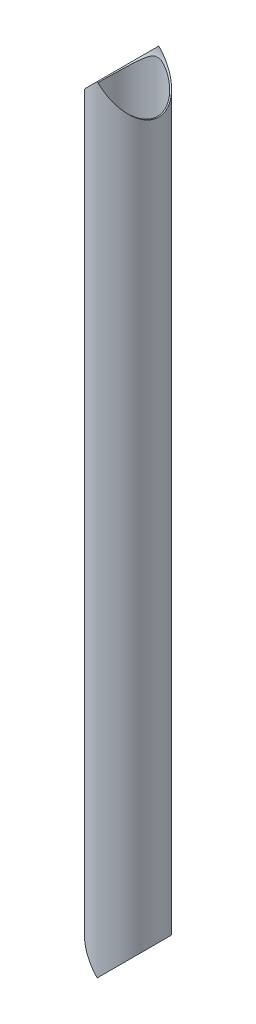
ISO-10303-21;
HEADER;
FILE_DESCRIPTION(('STEP AP214'),'2;1');
FILE_NAME('part.step','',(''),(''),'','','');
FILE_SCHEMA(('AUTOMOTIVE_DESIGN { 1 0 10303 214 1 1 1 1 }'));
ENDSEC;
DATA;
#1=APPLICATION_CONTEXT('core data for automotive mechanical design processes');
#2=APPLICATION_PROTOCOL_DEFINITION('international standard','automotive_design',2000,#1);
#3=PRODUCT_CONTEXT('',#1,'mechanical');
#4=PRODUCT('Part','Part','',(#3));
#5=PRODUCT_RELATED_PRODUCT_CATEGORY('part','',(#4));
#6=PRODUCT_DEFINITION_FORMATION('','',#4);
#7=PRODUCT_DEFINITION_CONTEXT('part definition',#1,'design');
#8=PRODUCT_DEFINITION('design','',#6,#7);
#9=PRODUCT_DEFINITION_SHAPE('','',#8);
#10=(LENGTH_UNIT() NAMED_UNIT(*) SI_UNIT(.MILLI.,.METRE.));
#11=(NAMED_UNIT(*) PLANE_ANGLE_UNIT() SI_UNIT($,.RADIAN.));
#12=(NAMED_UNIT(*) SI_UNIT($,.STERADIAN.) SOLID_ANGLE_UNIT());
#13=UNCERTAINTY_MEASURE_WITH_UNIT(LENGTH_MEASURE(1.E-05),#10,'distance_accuracy_value','');
#14=(GEOMETRIC_REPRESENTATION_CONTEXT(3) GLOBAL_UNCERTAINTY_ASSIGNED_CONTEXT((#13)) GLOBAL_UNIT_ASSIGNED_CONTEXT((#10,
#11,#12)) REPRESENTATION_CONTEXT('',''));
#15=CARTESIAN_POINT('',(0.,0.,0.));
#16=DIRECTION('',(0.,0.,1.));
#17=DIRECTION('',(1.,0.,0.));
#18=AXIS2_PLACEMENT_3D('',#15,#16,#17);
#19=CARTESIAN_POINT('',(476.510652388512,439.748427831157,242.672));
#20=DIRECTION('',(0.,1.,0.));
#21=DIRECTION('',(0.,0.,1.));
#22=AXIS2_PLACEMENT_3D('',#19,#20,#21);
#23=CYLINDRICAL_SURFACE('',#22,36.449);
#24=CARTESIAN_POINT('',(476.510652388512,-796.394911587709,206.223));
#25=CARTESIAN_POINT('',(476.866214470513,-796.39494214941,206.222994341681));
#26=CARTESIAN_POINT('',(477.22169744149,-796.377731995319,206.228216789073));
#27=CARTESIAN_POINT('',(477.929288915522,-796.310119843229,206.248898686295));
#28=CARTESIAN_POINT('',(478.281396235833,-796.259706614009,206.264361600058));
#29=CARTESIAN_POINT('',(478.98026219395,-796.128568465547,206.305069995408));
#30=CARTESIAN_POINT('',(479.327003101667,-796.047759096471,206.330342738024));
#31=CARTESIAN_POINT('',(480.012599362523,-795.860004194211,206.38998675138));
#32=CARTESIAN_POINT('',(480.351450551549,-795.753045187291,206.424362713364));
#33=CARTESIAN_POINT('',(481.228907293262,-795.444000358809,206.525541561417));
#34=CARTESIAN_POINT('',(481.760454369489,-795.224162276086,206.599204699403));
#35=CARTESIAN_POINT('',(482.801588995718,-794.743779294375,206.766119585938));
#36=CARTESIAN_POINT('',(483.311156804661,-794.483198734746,206.859388519708));
#37=CARTESIAN_POINT('',(484.312763012002,-793.932604577901,207.0641519399));
#38=CARTESIAN_POINT('',(484.804726788288,-793.642482062202,207.175714869938));
#39=CARTESIAN_POINT('',(485.771820306411,-793.042409921515,207.415674780719));
#40=CARTESIAN_POINT('',(486.246954704936,-792.732465848808,207.544067057825));
#41=CARTESIAN_POINT('',(487.266603779474,-792.042198013802,207.841420001988));
#42=CARTESIAN_POINT('',(487.80836925102,-791.659184876873,208.013531536308));
#43=CARTESIAN_POINT('',(488.87543085832,-790.880783163589,208.379727216007));
#44=CARTESIAN_POINT('',(489.400723310257,-790.485391858089,208.573816232035));
#45=CARTESIAN_POINT('',(490.437331743452,-789.68672295155,208.983899692638));
#46=CARTESIAN_POINT('',(490.948635050469,-789.283438732129,209.19991321761));
#47=CARTESIAN_POINT('',(491.958171546318,-788.472873100907,209.653672548512));
#48=CARTESIAN_POINT('',(492.456405767359,-788.065592008296,209.891416631452));
#49=CARTESIAN_POINT('',(493.440619034516,-787.249791922159,210.388726759251));
#50=CARTESIAN_POINT('',(493.926600620858,-786.841273205221,210.648288231739));
#51=CARTESIAN_POINT('',(494.886870092055,-786.02510628716,211.189497413899));
#52=CARTESIAN_POINT('',(495.361157778266,-785.617458100932,211.47114549842));
#53=CARTESIAN_POINT('',(496.297926045137,-784.805107847448,212.056671875453));
#54=CARTESIAN_POINT('',(496.76041234121,-784.400404424638,212.360539120597));
#55=CARTESIAN_POINT('',(497.673612858566,-783.595455924155,212.990919749797));
#56=CARTESIAN_POINT('',(498.124327139144,-783.195210824031,213.317433019758));
#57=CARTESIAN_POINT('',(499.361010825508,-782.09040858349,214.257556049199));
#58=CARTESIAN_POINT('',(500.133963413513,-781.392259287886,214.89626834423));
#59=CARTESIAN_POINT('',(501.261536898625,-780.365968421374,215.910483676035));
#60=CARTESIAN_POINT('',(501.632116693218,-780.027331442462,216.257946305791));
#61=CARTESIAN_POINT('',(502.362142888818,-779.357974170071,216.971983785208));
#62=CARTESIAN_POINT('',(502.721586086722,-779.027256160343,217.338564053603));
#63=CARTESIAN_POINT('',(503.780468870795,-778.050165598925,218.465632790855));
#64=CARTESIAN_POINT('',(504.462136991515,-777.417327620266,219.254948387263));
#65=CARTESIAN_POINT('',(505.770295445402,-776.197678563114,220.911565230277));
#66=CARTESIAN_POINT('',(506.396781671707,-775.610870910742,221.778872271634));
#67=CARTESIAN_POINT('',(507.431487216752,-774.638565247095,223.35679609504));
#68=CARTESIAN_POINT('',(507.8542735571,-774.24023253352,224.049984677227));
#69=CARTESIAN_POINT('',(508.659722856575,-773.479875204254,225.477866546872));
#70=CARTESIAN_POINT('',(509.042408888654,-773.117829714861,226.2125355886));
#71=CARTESIAN_POINT('',(509.763115456915,-772.434922004253,227.721993550622));
#72=CARTESIAN_POINT('',(510.101135106722,-772.114060600314,228.496783266662));
#73=CARTESIAN_POINT('',(510.727447244554,-771.518807173107,230.083593810325));
#74=CARTESIAN_POINT('',(511.01573889482,-771.244415932718,230.895615264895));
#75=CARTESIAN_POINT('',(511.540119330834,-770.744854467708,232.560845994832));
#76=CARTESIAN_POINT('',(511.775658917312,-770.520202327098,233.414385231727));
#77=CARTESIAN_POINT('',(512.185970146604,-770.128599177966,235.149007089444));
#78=CARTESIAN_POINT('',(512.360741428082,-769.961648512544,236.030089874011));
#79=CARTESIAN_POINT('',(512.64534167251,-769.689675194672,237.811297616409));
#80=CARTESIAN_POINT('',(512.755231478546,-769.584594523434,238.711403911534));
#81=CARTESIAN_POINT('',(512.907551461152,-769.43891897675,240.522436149383));
#82=CARTESIAN_POINT('',(512.949993046362,-769.398313195597,241.433360236047));
#83=CARTESIAN_POINT('',(512.96514823909,-769.383814249575,243.119793163351));
#84=CARTESIAN_POINT('',(512.947345982775,-769.400847076913,243.895167050997));
#85=CARTESIAN_POINT('',(512.862581349637,-769.481928351017,245.440678453986));
#86=CARTESIAN_POINT('',(512.795624878822,-769.545971149412,246.210816587199));
#87=CARTESIAN_POINT('',(512.613789731592,-769.719822536052,247.740154940216));
#88=CARTESIAN_POINT('',(512.498910096987,-769.829632039371,248.499354941006));
#89=CARTESIAN_POINT('',(512.223243904488,-770.09297702271,250.001644127843));
#90=CARTESIAN_POINT('',(512.062455617583,-770.246514149597,250.744732705969));
#91=CARTESIAN_POINT('',(511.701861985554,-770.590579089877,252.193153917395));
#92=CARTESIAN_POINT('',(511.503057004658,-770.780157892214,252.898963110777));
#93=CARTESIAN_POINT('',(511.066964962222,-771.195618958146,254.287526244673));
#94=CARTESIAN_POINT('',(510.829679872922,-771.42149936115,254.970281364623));
#95=CARTESIAN_POINT('',(510.319568215591,-771.906535028414,256.310213087119));
#96=CARTESIAN_POINT('',(510.046738229427,-772.165693492785,256.967387221795));
#97=CARTESIAN_POINT('',(509.468471050447,-772.714227386438,258.254348100605));
#98=CARTESIAN_POINT('',(509.163027011418,-773.003609159798,258.88412905527));
#99=CARTESIAN_POINT('',(508.608659120239,-773.527966985482,259.949291297323));
#100=CARTESIAN_POINT('',(508.366625955861,-773.756645379099,260.391404719744));
#101=CARTESIAN_POINT('',(507.867842330127,-774.227278037621,261.259817195315));
#102=CARTESIAN_POINT('',(507.611094558151,-774.469229876203,261.686119115013));
#103=CARTESIAN_POINT('',(506.82002390388,-775.213595007675,262.941437286861));
#104=CARTESIAN_POINT('',(506.264969333909,-775.734427324938,263.746683560699));
#105=CARTESIAN_POINT('',(505.105886481022,-776.817827335624,265.294550970115));
#106=CARTESIAN_POINT('',(504.501743544192,-777.380492460086,266.037016716067));
#107=CARTESIAN_POINT('',(503.251643952636,-778.539015973301,267.457970035601));
#108=CARTESIAN_POINT('',(502.60568849643,-779.134873410556,268.136459441644));
#109=CARTESIAN_POINT('',(501.492814994195,-780.154903392491,269.220317238375));
#110=CARTESIAN_POINT('',(501.035898517613,-780.571972181724,269.642812616338));
#111=CARTESIAN_POINT('',(500.10638496387,-781.416076973201,270.45965533636));
#112=CARTESIAN_POINT('',(499.633788276544,-781.84311272757,270.854003377444));
#113=CARTESIAN_POINT('',(498.673581379377,-782.705384892667,271.615216377981));
#114=CARTESIAN_POINT('',(498.185963162426,-783.140625627299,271.982066309183));
#115=CARTESIAN_POINT('',(497.196587700303,-784.017054827887,272.688514867113));
#116=CARTESIAN_POINT('',(496.694830874212,-784.458243117351,273.028114300425));
#117=CARTESIAN_POINT('',(495.677966334072,-785.344005516987,273.680194933274));
#118=CARTESIAN_POINT('',(495.162872085164,-785.788575915159,273.99270219679));
#119=CARTESIAN_POINT('',(494.118769551406,-786.679174103479,274.591367180444));
#120=CARTESIAN_POINT('',(493.58976058219,-787.125201964362,274.877523601444));
#121=CARTESIAN_POINT('',(492.51766860484,-788.01560781731,275.423591294656));
#122=CARTESIAN_POINT('',(491.974594759868,-788.459986678135,275.683519139683));
#123=CARTESIAN_POINT('',(490.873005380616,-789.34384540984,276.17747499688));
#124=CARTESIAN_POINT('',(490.314492050232,-789.783325967485,276.411506681958));
#125=CARTESIAN_POINT('',(489.286667000424,-790.571047755042,276.81211379431));
#126=CARTESIAN_POINT('',(488.820318336025,-790.920913349901,276.983100595245));
#127=CARTESIAN_POINT('',(487.874576964869,-791.610960256955,277.307832010658));
#128=CARTESIAN_POINT('',(487.395184276413,-791.951141582734,277.461576649326));
#129=CARTESIAN_POINT('',(486.42133936682,-792.617091151689,277.751424175755));
#130=CARTESIAN_POINT('',(485.926889372417,-792.942861508706,277.887529656569));
#131=CARTESIAN_POINT('',(484.920176053243,-793.573390079684,278.141409766625));
#132=CARTESIAN_POINT('',(484.407917446481,-793.878153796039,278.259189206358));
#133=CARTESIAN_POINT('',(483.528797639687,-794.364779586244,278.440805594312));
#134=CARTESIAN_POINT('',(483.167588150206,-794.554871444225,278.509875866972));
#135=CARTESIAN_POINT('',(482.434208972682,-794.916599577116,278.638369246777));
#136=CARTESIAN_POINT('',(482.062037781871,-795.088233306408,278.697791023842));
#137=CARTESIAN_POINT('',(481.307014479821,-795.407315730861,278.806049104647));
#138=CARTESIAN_POINT('',(480.924193199586,-795.55482715098,278.854912971963));
#139=CARTESIAN_POINT('',(480.14717040079,-795.819820773527,278.941243359243));
#140=CARTESIAN_POINT('',(479.75297612085,-795.937321627284,278.978716960931));
#141=CARTESIAN_POINT('',(478.88965933871,-796.151585357063,279.046251308342));
#142=CARTESIAN_POINT('',(478.418718898684,-796.241932687243,279.074136924716));
#143=CARTESIAN_POINT('',(477.468683171403,-796.363547348822,279.111498775102));
#144=CARTESIAN_POINT('',(476.989596009632,-796.394870420968,279.120992378221));
#145=CARTESIAN_POINT('',(476.155090306511,-796.39494214941,279.121005658319));
#146=CARTESIAN_POINT('',(475.799607335534,-796.377731995319,279.115783210927));
#147=CARTESIAN_POINT('',(475.092015861502,-796.310119843229,279.095101313705));
#148=CARTESIAN_POINT('',(474.739908541191,-796.259706614009,279.079638399942));
#149=CARTESIAN_POINT('',(474.041042583074,-796.128568465547,279.038930004592));
#150=CARTESIAN_POINT('',(473.694301675357,-796.047759096471,279.013657261976));
#151=CARTESIAN_POINT('',(473.008705414501,-795.860004194211,278.95401324862));
#152=CARTESIAN_POINT('',(472.669854225475,-795.753045187291,278.919637286637));
#153=CARTESIAN_POINT('',(471.792397483762,-795.444000358809,278.818458438583));
#154=CARTESIAN_POINT('',(471.260850407535,-795.224162276086,278.744795300597));
#155=CARTESIAN_POINT('',(470.219715781306,-794.743779294375,278.577880414062));
#156=CARTESIAN_POINT('',(469.710147972363,-794.483198734746,278.484611480292));
#157=CARTESIAN_POINT('',(468.708541765022,-793.932604577901,278.2798480601));
#158=CARTESIAN_POINT('',(468.216577988736,-793.642482062202,278.168285130062));
#159=CARTESIAN_POINT('',(467.249484470613,-793.042409921515,277.928325219281));
#160=CARTESIAN_POINT('',(466.774350072088,-792.732465848808,277.799932942175));
#161=CARTESIAN_POINT('',(465.75470099755,-792.042198013802,277.502579998012));
#162=CARTESIAN_POINT('',(465.212935526004,-791.659184876873,277.330468463692));
#163=CARTESIAN_POINT('',(464.145873918704,-790.880783163589,276.964272783993));
#164=CARTESIAN_POINT('',(463.620581466767,-790.485391858089,276.770183767965));
#165=CARTESIAN_POINT('',(462.583973033572,-789.68672295155,276.360100307361));
#166=CARTESIAN_POINT('',(462.072669726555,-789.283438732129,276.14408678239));
#167=CARTESIAN_POINT('',(461.063133230706,-788.472873100907,275.690327451488));
#168=CARTESIAN_POINT('',(460.564899009665,-788.065592008296,275.452583368548));
#169=CARTESIAN_POINT('',(459.580685742508,-787.249791922158,274.955273240749));
#170=CARTESIAN_POINT('',(459.094704156166,-786.841273205221,274.695711768261));
#171=CARTESIAN_POINT('',(458.134434684969,-786.02510628716,274.1545025861));
#172=CARTESIAN_POINT('',(457.660146998758,-785.617458100932,273.87285450158));
#173=CARTESIAN_POINT('',(456.723378731887,-784.805107847448,273.287328124547));
#174=CARTESIAN_POINT('',(456.260892435814,-784.400404424638,272.983460879403));
#175=CARTESIAN_POINT('',(455.347691918458,-783.595455924155,272.353080250203));
#176=CARTESIAN_POINT('',(454.89697763788,-783.195210824031,272.026566980242));
#177=CARTESIAN_POINT('',(453.660293951516,-782.09040858349,271.086443950801));
#178=CARTESIAN_POINT('',(452.887341363511,-781.392259287886,270.44773165577));
#179=CARTESIAN_POINT('',(451.759767878399,-780.365968421374,269.433516323965));
#180=CARTESIAN_POINT('',(451.389188083806,-780.027331442462,269.086053694209));
#181=CARTESIAN_POINT('',(450.659161888206,-779.357974170071,268.372016214792));
#182=CARTESIAN_POINT('',(450.299718690302,-779.027256160343,268.005435946397));
#183=CARTESIAN_POINT('',(449.240835906229,-778.050165598925,266.878367209144));
#184=CARTESIAN_POINT('',(448.559167785509,-777.417327620266,266.089051612736));
#185=CARTESIAN_POINT('',(447.251009331622,-776.197678563114,264.432434769723));
#186=CARTESIAN_POINT('',(446.624523105317,-775.610870910742,263.565127728366));
#187=CARTESIAN_POINT('',(445.589817560272,-774.638565247095,261.98720390496));
#188=CARTESIAN_POINT('',(445.167031219924,-774.24023253352,261.294015322773));
#189=CARTESIAN_POINT('',(444.361581920449,-773.479875204254,259.866133453128));
#190=CARTESIAN_POINT('',(443.97889588837,-773.117829714861,259.1314644114));
#191=CARTESIAN_POINT('',(443.258189320109,-772.434922004253,257.622006449378));
#192=CARTESIAN_POINT('',(442.920169670303,-772.114060600314,256.847216733338));
#193=CARTESIAN_POINT('',(442.29385753247,-771.518807173107,255.260406189675));
#194=CARTESIAN_POINT('',(442.005565882204,-771.244415932718,254.448384735105));
#195=CARTESIAN_POINT('',(441.48118544619,-770.744854467708,252.783154005168));
#196=CARTESIAN_POINT('',(441.245645859712,-770.520202327098,251.929614768273));
#197=CARTESIAN_POINT('',(440.83533463042,-770.128599177966,250.194992910556));
#198=CARTESIAN_POINT('',(440.660563348942,-769.961648512544,249.313910125989));
#199=CARTESIAN_POINT('',(440.375963104514,-769.689675194672,247.532702383591));
#200=CARTESIAN_POINT('',(440.266073298478,-769.584594523434,246.632596088466));
#201=CARTESIAN_POINT('',(440.113753315872,-769.43891897675,244.821563850617));
#202=CARTESIAN_POINT('',(440.071311730662,-769.398313195597,243.910639763953));
#203=CARTESIAN_POINT('',(440.056156537934,-769.383814249575,242.224206836649));
#204=CARTESIAN_POINT('',(440.073958794249,-769.400847076913,241.448832949003));
#205=CARTESIAN_POINT('',(440.158723427387,-769.481928351017,239.903321546014));
#206=CARTESIAN_POINT('',(440.225679898202,-769.545971149412,239.133183412801));
#207=CARTESIAN_POINT('',(440.407515045432,-769.719822536052,237.603845059783));
#208=CARTESIAN_POINT('',(440.522394680037,-769.829632039371,236.844645058994));
#209=CARTESIAN_POINT('',(440.798060872536,-770.09297702271,235.342355872157));
#210=CARTESIAN_POINT('',(440.958849159441,-770.246514149597,234.59926729403));
#211=CARTESIAN_POINT('',(441.31944279147,-770.590579089877,233.150846082605));
#212=CARTESIAN_POINT('',(441.518247772366,-770.780157892214,232.445036889223));
#213=CARTESIAN_POINT('',(441.954339814802,-771.195618958146,231.056473755327));
#214=CARTESIAN_POINT('',(442.191624904102,-771.42149936115,230.373718635377));
#215=CARTESIAN_POINT('',(442.701736561433,-771.906535028414,229.033786912881));
#216=CARTESIAN_POINT('',(442.974566547597,-772.165693492785,228.376612778205));
#217=CARTESIAN_POINT('',(443.552833726577,-772.714227386438,227.089651899395));
#218=CARTESIAN_POINT('',(443.858277765606,-773.003609159798,226.45987094473));
#219=CARTESIAN_POINT('',(444.412645656785,-773.527966985483,225.394708702677));
#220=CARTESIAN_POINT('',(444.654678821163,-773.756645379099,224.952595280256));
#221=CARTESIAN_POINT('',(445.153462446897,-774.227278037621,224.084182804685));
#222=CARTESIAN_POINT('',(445.410210218873,-774.469229876203,223.657880884987));
#223=CARTESIAN_POINT('',(446.201280873144,-775.213595007675,222.402562713139));
#224=CARTESIAN_POINT('',(446.756335443115,-775.734427324938,221.597316439301));
#225=CARTESIAN_POINT('',(447.915418296003,-776.817827335624,220.049449029885));
#226=CARTESIAN_POINT('',(448.519561232832,-777.380492460086,219.306983283933));
#227=CARTESIAN_POINT('',(449.769660824388,-778.539015973301,217.886029964399));
#228=CARTESIAN_POINT('',(450.415616280594,-779.134873410556,217.207540558356));
#229=CARTESIAN_POINT('',(451.528489782829,-780.154903392491,216.123682761625));
#230=CARTESIAN_POINT('',(451.985406259411,-780.571972181724,215.701187383662));
#231=CARTESIAN_POINT('',(452.914919813155,-781.416076973201,214.88434466364));
#232=CARTESIAN_POINT('',(453.38751650048,-781.84311272757,214.489996622556));
#233=CARTESIAN_POINT('',(454.347723397647,-782.705384892667,213.728783622019));
#234=CARTESIAN_POINT('',(454.835341614599,-783.140625627299,213.361933690817));
#235=CARTESIAN_POINT('',(455.824717076722,-784.017054827887,212.655485132887));
#236=CARTESIAN_POINT('',(456.326473902812,-784.458243117351,212.315885699575));
#237=CARTESIAN_POINT('',(457.343338442953,-785.344005516987,211.663805066726));
#238=CARTESIAN_POINT('',(457.858432691861,-785.788575915159,211.35129780321));
#239=CARTESIAN_POINT('',(458.902535225618,-786.679174103479,210.752632819556));
#240=CARTESIAN_POINT('',(459.431544194834,-787.125201964362,210.466476398556));
#241=CARTESIAN_POINT('',(460.503636172184,-788.01560781731,209.920408705344));
#242=CARTESIAN_POINT('',(461.046710017157,-788.459986678135,209.660480860317));
#243=CARTESIAN_POINT('',(462.148299396409,-789.34384540984,209.16652500312));
#244=CARTESIAN_POINT('',(462.706812726792,-789.783325967485,208.932493318042));
#245=CARTESIAN_POINT('',(463.734637776601,-790.571047755042,208.53188620569));
#246=CARTESIAN_POINT('',(464.200986440999,-790.920913349901,208.360899404755));
#247=CARTESIAN_POINT('',(465.146727812155,-791.610960256955,208.036167989342));
#248=CARTESIAN_POINT('',(465.626120500611,-791.951141582734,207.882423350674));
#249=CARTESIAN_POINT('',(466.599965410204,-792.617091151689,207.592575824245));
#250=CARTESIAN_POINT('',(467.094415404607,-792.942861508706,207.456470343431));
#251=CARTESIAN_POINT('',(468.101128723781,-793.573390079684,207.202590233375));
#252=CARTESIAN_POINT('',(468.613387330543,-793.878153796039,207.084810793642));
#253=CARTESIAN_POINT('',(469.492507137337,-794.364779586244,206.903194405688));
#254=CARTESIAN_POINT('',(469.853716626818,-794.554871444225,206.834124133028));
#255=CARTESIAN_POINT('',(470.587095804342,-794.916599577116,206.705630753223));
#256=CARTESIAN_POINT('',(470.959266995153,-795.088233306408,206.646208976158));
#257=CARTESIAN_POINT('',(471.714290297204,-795.407315730861,206.537950895353));
#258=CARTESIAN_POINT('',(472.097111577438,-795.55482715098,206.489087028037));
#259=CARTESIAN_POINT('',(472.874134376234,-795.819820773527,206.402756640757));
#260=CARTESIAN_POINT('',(473.268328656174,-795.937321627284,206.365283039069));
#261=CARTESIAN_POINT('',(474.131645438314,-796.151585357063,206.297748691658));
#262=CARTESIAN_POINT('',(474.60258587834,-796.241932687243,206.269863075285));
#263=CARTESIAN_POINT('',(475.552621605621,-796.363547348822,206.232501224898));
#264=CARTESIAN_POINT('',(476.031708767392,-796.394870420968,206.223007621779));
#265=CARTESIAN_POINT('',(476.510652388512,-796.394911587709,206.223));
#266=B_SPLINE_CURVE_WITH_KNOTS('',3,(#24,#25,#26,#27,#28,#29,#30,#31,#32,#33,#34,#35,#36,#37,
#38,#39,#40,#41,#42,#43,#44,#45,#46,#47,#48,#49,#50,#51,#52,#53,#54,#55,#56,#57,#58,#59,#60,#61,
#62,#63,#64,#65,#66,#67,#68,#69,#70,#71,#72,#73,#74,#75,#76,#77,#78,#79,#80,#81,#82,#83,#84,#85,
#86,#87,#88,#89,#90,#91,#92,#93,#94,#95,#96,#97,#98,#99,#100,#101,#102,#103,#104,#105,#106,#107,
#108,#109,#110,#111,#112,#113,#114,#115,#116,#117,#118,#119,#120,#121,#122,#123,#124,#125,#126,
#127,#128,#129,#130,#131,#132,#133,#134,#135,#136,#137,#138,#139,#140,#141,#142,#143,#144,#145,
#146,#147,#148,#149,#150,#151,#152,#153,#154,#155,#156,#157,#158,#159,#160,#161,#162,#163,#164,
#165,#166,#167,#168,#169,#170,#171,#172,#173,#174,#175,#176,#177,#178,#179,#180,#181,#182,#183,
#184,#185,#186,#187,#188,#189,#190,#191,#192,#193,#194,#195,#196,#197,#198,#199,#200,#201,#202,
#203,#204,#205,#206,#207,#208,#209,#210,#211,#212,#213,#214,#215,#216,#217,#218,#219,#220,#221,
#222,#223,#224,#225,#226,#227,#228,#229,#230,#231,#232,#233,#234,#235,#236,#237,#238,#239,#240,
#241,#242,#243,#244,#245,#246,#247,#248,#249,#250,#251,#252,#253,#254,#255,#256,#257,#258,#259,
#260,#261,#262,#263,#264,#265),.UNSPECIFIED.,.T.,.F.,(4,2,2,2,2,2,2,2,2,2,2,2,2,2,2,2,2,2,2,2,2,
2,2,2,2,2,2,2,2,2,2,2,2,2,2,2,2,2,2,2,2,2,2,2,2,2,2,2,2,2,2,2,2,2,2,2,2,2,2,2,2,2,2,2,2,2,2,2,2,
2,2,2,2,2,2,2,2,2,2,2,2,2,2,2,2,2,2,2,2,2,2,2,2,2,2,2,2,2,2,2,2,2,2,2,2,2,2,2,2,2,2,2,2,2,2,2,2,
2,2,2,4),(0.,1.06611414843416,2.13258910425996,3.20204920766219,4.27206152160816,
6.00863124127422,7.74672952495685,9.4914855092719,11.2357548870451,13.2912846778382,
15.3472709100307,17.4050620168484,19.4626901051605,21.5198880369984,23.5771208905832,
25.6333377531719,27.6895442568481,31.3512740154256,33.1824611102563,35.0141700909461,
38.6694544918159,42.3250107044665,45.0358911223804,47.745203086163,50.4545688064838,
53.1639801666921,55.9004081106273,58.636852325462,61.3707263268615,64.1041378534622,
66.428502550992,68.7525880157005,71.0767199511114,73.4009394294494,75.6708059402843,
77.9405561492151,80.2105247872817,82.4809708684053,84.1408274219292,85.8003815658468,
89.1201624002975,92.4479332286087,95.7756087113101,98.0223469896221,100.269029451901,
102.516930950406,104.764765889109,107.010413731493,109.256172228638,111.500502714162,
113.74451447239,115.566784640591,117.389052252358,119.211051676383,121.032572025353,
122.273977222302,123.515553406376,124.753847952514,125.991371025463,127.428789407636,
128.864849653164,129.930963801598,130.997438757424,132.066898860826,133.136911174772,
134.873480894438,136.61157917812,138.356335162435,140.100604540209,142.156134331002,
144.212120563194,146.269911670012,148.327539758324,150.384737690162,152.441970543747,
154.498187406336,156.554393910012,160.216123668589,162.04731076342,163.87901974411,
167.53430414498,171.18986035763,173.900740775544,176.610052739327,179.319418459647,
182.028829819856,184.765257763791,187.501701978626,190.235575980025,192.968987506626,
195.293352204156,197.617437668864,199.941569604275,202.265789082613,204.535655593448,
206.805405802379,209.075374440445,211.345820521569,213.005677075093,214.665231219011,
217.985012053461,221.312782881773,224.640458364474,226.887196642786,229.133879105065,
231.38178060357,233.629615542273,235.875263384657,238.121021881802,240.365352367326,
242.609364125554,244.431634293755,246.253901905522,248.075901329547,249.897421678517,
251.138826875466,252.380403059539,253.618697605678,254.856220678626,256.293639060799,
257.729699306327),.UNSPECIFIED.);
#267=CARTESIAN_POINT('',(476.510652388512,-796.394911587709,206.223));
#268=VERTEX_POINT('',#267);
#269=EDGE_CURVE('E20',#268,#268,#266,.T.);
#270=ORIENTED_EDGE('',*,*,#269,.T.);
#271=EDGE_LOOP('',(#270));
#272=FACE_BOUND('',#271,.T.);
#273=CARTESIAN_POINT('',(476.510652388512,141.416767250022,206.223));
#274=CARTESIAN_POINT('',(476.155090306511,141.416797811724,206.222994341681));
#275=CARTESIAN_POINT('',(475.799607335534,141.399587657633,206.228216789073));
#276=CARTESIAN_POINT('',(475.092015861502,141.331975505542,206.248898686295));
#277=CARTESIAN_POINT('',(474.739908541191,141.281562276323,206.264361600058));
#278=CARTESIAN_POINT('',(474.041042583074,141.150424127861,206.305069995408));
#279=CARTESIAN_POINT('',(473.694301675357,141.069614758785,206.330342738024));
#280=CARTESIAN_POINT('',(473.008705414501,140.881859856525,206.38998675138));
#281=CARTESIAN_POINT('',(472.669854225475,140.774900849605,206.424362713363));
#282=CARTESIAN_POINT('',(471.792397483762,140.465856021123,206.525541561417));
#283=CARTESIAN_POINT('',(471.260850407535,140.2460179384,206.599204699403));
#284=CARTESIAN_POINT('',(470.219715781306,139.765634956689,206.766119585938));
#285=CARTESIAN_POINT('',(469.710147972363,139.50505439706,206.859388519708));
#286=CARTESIAN_POINT('',(468.708541765022,138.954460240215,207.0641519399));
#287=CARTESIAN_POINT('',(468.216577988736,138.664337724516,207.175714869938));
#288=CARTESIAN_POINT('',(467.249484470613,138.064265583829,207.415674780719));
#289=CARTESIAN_POINT('',(466.774350072088,137.754321511122,207.544067057825));
#290=CARTESIAN_POINT('',(465.75470099755,137.064053676117,207.841420001988));
#291=CARTESIAN_POINT('',(465.212935526005,136.681040539187,208.013531536308));
#292=CARTESIAN_POINT('',(464.145873918704,135.902638825903,208.379727216007));
#293=CARTESIAN_POINT('',(463.620581466767,135.507247520403,208.573816232035));
#294=CARTESIAN_POINT('',(462.583973033572,134.708578613864,208.983899692638));
#295=CARTESIAN_POINT('',(462.072669726555,134.305294394443,209.19991321761));
#296=CARTESIAN_POINT('',(461.063133230706,133.494728763221,209.653672548512));
#297=CARTESIAN_POINT('',(460.564899009666,133.08744767061,209.891416631452));
#298=CARTESIAN_POINT('',(459.580685742508,132.271647584473,210.388726759251));
#299=CARTESIAN_POINT('',(459.094704156167,131.863128867535,210.648288231739));
#300=CARTESIAN_POINT('',(458.134434684969,131.046961949474,211.189497413899));
#301=CARTESIAN_POINT('',(457.660146998758,130.639313763246,211.47114549842));
#302=CARTESIAN_POINT('',(456.723378731887,129.826963509762,212.056671875453));
#303=CARTESIAN_POINT('',(456.260892435815,129.422260086952,212.360539120597));
#304=CARTESIAN_POINT('',(455.347691918458,128.617311586469,212.990919749797));
#305=CARTESIAN_POINT('',(454.89697763788,128.217066486345,213.317433019758));
#306=CARTESIAN_POINT('',(453.660293951516,127.112264245804,214.257556049199));
#307=CARTESIAN_POINT('',(452.887341363511,126.4141149502,214.89626834423));
#308=CARTESIAN_POINT('',(451.759767878399,125.387824083688,215.910483676035));
#309=CARTESIAN_POINT('',(451.389188083806,125.049187104776,216.257946305791));
#310=CARTESIAN_POINT('',(450.659161888206,124.379829832385,216.971983785208));
#311=CARTESIAN_POINT('',(450.299718690302,124.049111822658,217.338564053603));
#312=CARTESIAN_POINT('',(449.240835906229,123.072021261239,218.465632790855));
#313=CARTESIAN_POINT('',(448.55916778551,122.43918328258,219.254948387263));
#314=CARTESIAN_POINT('',(447.251009331622,121.219534225428,220.911565230277));
#315=CARTESIAN_POINT('',(446.624523105317,120.632726573056,221.778872271634));
#316=CARTESIAN_POINT('',(445.589817560273,119.660420909409,223.35679609504));
#317=CARTESIAN_POINT('',(445.167031219924,119.262088195834,224.049984677227));
#318=CARTESIAN_POINT('',(444.361581920449,118.501730866568,225.477866546872));
#319=CARTESIAN_POINT('',(443.97889588837,118.139685377175,226.212535588599));
#320=CARTESIAN_POINT('',(443.258189320109,117.456777666567,227.721993550622));
#321=CARTESIAN_POINT('',(442.920169670303,117.135916262628,228.496783266662));
#322=CARTESIAN_POINT('',(442.29385753247,116.540662835421,230.083593810325));
#323=CARTESIAN_POINT('',(442.005565882204,116.266271595032,230.895615264895));
#324=CARTESIAN_POINT('',(441.48118544619,115.766710130022,232.560845994832));
#325=CARTESIAN_POINT('',(441.245645859712,115.542057989412,233.414385231727));
#326=CARTESIAN_POINT('',(440.83533463042,115.15045484028,235.149007089444));
#327=CARTESIAN_POINT('',(440.660563348942,114.983504174858,236.030089874011));
#328=CARTESIAN_POINT('',(440.375963104514,114.711530856986,237.811297616409));
#329=CARTESIAN_POINT('',(440.266073298478,114.606450185748,238.711403911534));
#330=CARTESIAN_POINT('',(440.113753315872,114.460774639064,240.522436149383));
#331=CARTESIAN_POINT('',(440.071311730662,114.420168857911,241.433360236047));
#332=CARTESIAN_POINT('',(440.056156537934,114.405669911889,243.119793163351));
#333=CARTESIAN_POINT('',(440.073958794249,114.422702739227,243.895167050997));
#334=CARTESIAN_POINT('',(440.158723427387,114.503784013331,245.440678453986));
#335=CARTESIAN_POINT('',(440.225679898202,114.567826811726,246.210816587199));
#336=CARTESIAN_POINT('',(440.407515045432,114.741678198366,247.740154940217));
#337=CARTESIAN_POINT('',(440.522394680037,114.851487701685,248.499354941006));
#338=CARTESIAN_POINT('',(440.798060872536,115.114832685024,250.001644127843));
#339=CARTESIAN_POINT('',(440.958849159441,115.268369811911,250.744732705969));
#340=CARTESIAN_POINT('',(441.31944279147,115.612434752191,252.193153917395));
#341=CARTESIAN_POINT('',(441.518247772366,115.802013554528,252.898963110777));
#342=CARTESIAN_POINT('',(441.954339814802,116.21747462046,254.287526244673));
#343=CARTESIAN_POINT('',(442.191624904102,116.443355023464,254.970281364623));
#344=CARTESIAN_POINT('',(442.701736561433,116.928390690728,256.310213087119));
#345=CARTESIAN_POINT('',(442.974566547597,117.187549155099,256.967387221795));
#346=CARTESIAN_POINT('',(443.552833726577,117.736083048752,258.254348100605));
#347=CARTESIAN_POINT('',(443.858277765606,118.025464822112,258.88412905527));
#348=CARTESIAN_POINT('',(444.412645656785,118.549822647796,259.949291297323));
#349=CARTESIAN_POINT('',(444.654678821163,118.778501041413,260.391404719744));
#350=CARTESIAN_POINT('',(445.153462446897,119.249133699935,261.259817195315));
#351=CARTESIAN_POINT('',(445.410210218873,119.491085538517,261.686119115013));
#352=CARTESIAN_POINT('',(446.201280873144,120.235450669989,262.941437286861));
#353=CARTESIAN_POINT('',(446.756335443115,120.756282987252,263.746683560699));
#354=CARTESIAN_POINT('',(447.915418296002,121.839682997938,265.294550970115));
#355=CARTESIAN_POINT('',(448.519561232832,122.4023481224,266.037016716067));
#356=CARTESIAN_POINT('',(449.769660824388,123.560871635615,267.457970035601));
#357=CARTESIAN_POINT('',(450.415616280594,124.15672907287,268.136459441644));
#358=CARTESIAN_POINT('',(451.528489782829,125.176759054805,269.220317238375));
#359=CARTESIAN_POINT('',(451.985406259411,125.593827844038,269.642812616338));
#360=CARTESIAN_POINT('',(452.914919813154,126.437932635515,270.45965533636));
#361=CARTESIAN_POINT('',(453.38751650048,126.864968389884,270.854003377444));
#362=CARTESIAN_POINT('',(454.347723397647,127.727240554981,271.615216377981));
#363=CARTESIAN_POINT('',(454.835341614599,128.162481289612,271.982066309183));
#364=CARTESIAN_POINT('',(455.824717076722,129.038910490201,272.688514867113));
#365=CARTESIAN_POINT('',(456.326473902812,129.480098779665,273.028114300425));
#366=CARTESIAN_POINT('',(457.343338442953,130.365861179301,273.680194933274));
#367=CARTESIAN_POINT('',(457.85843269186,130.810431577473,273.99270219679));
#368=CARTESIAN_POINT('',(458.902535225618,131.701029765793,274.591367180444));
#369=CARTESIAN_POINT('',(459.431544194834,132.147057626676,274.877523601444));
#370=CARTESIAN_POINT('',(460.503636172184,133.037463479624,275.423591294656));
#371=CARTESIAN_POINT('',(461.046710017157,133.481842340449,275.683519139683));
#372=CARTESIAN_POINT('',(462.148299396408,134.365701072154,276.17747499688));
#373=CARTESIAN_POINT('',(462.706812726792,134.805181629799,276.411506681958));
#374=CARTESIAN_POINT('',(463.7346377766,135.592903417356,276.81211379431));
#375=CARTESIAN_POINT('',(464.200986440999,135.942769012215,276.983100595245));
#376=CARTESIAN_POINT('',(465.146727812155,136.632815919269,277.307832010658));
#377=CARTESIAN_POINT('',(465.626120500611,136.972997245048,277.461576649326));
#378=CARTESIAN_POINT('',(466.599965410204,137.638946814003,277.751424175755));
#379=CARTESIAN_POINT('',(467.094415404607,137.96471717102,277.887529656569));
#380=CARTESIAN_POINT('',(468.101128723781,138.595245741998,278.141409766625));
#381=CARTESIAN_POINT('',(468.613387330543,138.900009458353,278.259189206358));
#382=CARTESIAN_POINT('',(469.492507137337,139.386635248558,278.440805594312));
#383=CARTESIAN_POINT('',(469.853716626818,139.576727106539,278.509875866972));
#384=CARTESIAN_POINT('',(470.587095804342,139.93845523943,278.638369246777));
#385=CARTESIAN_POINT('',(470.959266995153,140.110088968722,278.697791023842));
#386=CARTESIAN_POINT('',(471.714290297204,140.429171393175,278.806049104647));
#387=CARTESIAN_POINT('',(472.097111577438,140.576682813294,278.854912971963));
#388=CARTESIAN_POINT('',(472.874134376234,140.841676435841,278.941243359243));
#389=CARTESIAN_POINT('',(473.268328656174,140.959177289598,278.978716960931));
#390=CARTESIAN_POINT('',(474.131645438314,141.173441019377,279.046251308342));
#391=CARTESIAN_POINT('',(474.60258587834,141.263788349557,279.074136924716));
#392=CARTESIAN_POINT('',(475.552621605621,141.385403011136,279.111498775102));
#393=CARTESIAN_POINT('',(476.031708767392,141.416726083282,279.120992378221));
#394=CARTESIAN_POINT('',(476.866214470513,141.416797811724,279.121005658319));
#395=CARTESIAN_POINT('',(477.22169744149,141.399587657633,279.115783210927));
#396=CARTESIAN_POINT('',(477.929288915522,141.331975505542,279.095101313705));
#397=CARTESIAN_POINT('',(478.281396235833,141.281562276323,279.079638399942));
#398=CARTESIAN_POINT('',(478.980262193951,141.150424127861,279.038930004592));
#399=CARTESIAN_POINT('',(479.327003101667,141.069614758785,279.013657261976));
#400=CARTESIAN_POINT('',(480.012599362523,140.881859856525,278.95401324862));
#401=CARTESIAN_POINT('',(480.351450551549,140.774900849605,278.919637286637));
#402=CARTESIAN_POINT('',(481.228907293262,140.465856021123,278.818458438583));
#403=CARTESIAN_POINT('',(481.760454369489,140.2460179384,278.744795300597));
#404=CARTESIAN_POINT('',(482.801588995718,139.765634956689,278.577880414062));
#405=CARTESIAN_POINT('',(483.311156804661,139.50505439706,278.484611480292));
#406=CARTESIAN_POINT('',(484.312763012002,138.954460240215,278.2798480601));
#407=CARTESIAN_POINT('',(484.804726788288,138.664337724516,278.168285130062));
#408=CARTESIAN_POINT('',(485.771820306411,138.064265583829,277.928325219281));
#409=CARTESIAN_POINT('',(486.246954704936,137.754321511122,277.799932942175));
#410=CARTESIAN_POINT('',(487.266603779474,137.064053676117,277.502579998012));
#411=CARTESIAN_POINT('',(487.80836925102,136.681040539187,277.330468463692));
#412=CARTESIAN_POINT('',(488.87543085832,135.902638825903,276.964272783993));
#413=CARTESIAN_POINT('',(489.400723310257,135.507247520403,276.770183767965));
#414=CARTESIAN_POINT('',(490.437331743452,134.708578613864,276.360100307362));
#415=CARTESIAN_POINT('',(490.948635050469,134.305294394443,276.14408678239));
#416=CARTESIAN_POINT('',(491.958171546318,133.494728763221,275.690327451488));
#417=CARTESIAN_POINT('',(492.456405767359,133.08744767061,275.452583368548));
#418=CARTESIAN_POINT('',(493.440619034516,132.271647584473,274.955273240749));
#419=CARTESIAN_POINT('',(493.926600620858,131.863128867535,274.695711768261));
#420=CARTESIAN_POINT('',(494.886870092055,131.046961949474,274.154502586101));
#421=CARTESIAN_POINT('',(495.361157778266,130.639313763246,273.87285450158));
#422=CARTESIAN_POINT('',(496.297926045137,129.826963509762,273.287328124547));
#423=CARTESIAN_POINT('',(496.76041234121,129.422260086952,272.983460879403));
#424=CARTESIAN_POINT('',(497.673612858566,128.617311586469,272.353080250203));
#425=CARTESIAN_POINT('',(498.124327139144,128.217066486345,272.026566980242));
#426=CARTESIAN_POINT('',(499.361010825508,127.112264245804,271.086443950801));
#427=CARTESIAN_POINT('',(500.133963413513,126.4141149502,270.44773165577));
#428=CARTESIAN_POINT('',(501.261536898625,125.387824083688,269.433516323965));
#429=CARTESIAN_POINT('',(501.632116693218,125.049187104776,269.086053694209));
#430=CARTESIAN_POINT('',(502.362142888818,124.379829832385,268.372016214792));
#431=CARTESIAN_POINT('',(502.721586086722,124.049111822657,268.005435946397));
#432=CARTESIAN_POINT('',(503.780468870795,123.072021261239,266.878367209145));
#433=CARTESIAN_POINT('',(504.462136991515,122.43918328258,266.089051612737));
#434=CARTESIAN_POINT('',(505.770295445402,121.219534225428,264.432434769723));
#435=CARTESIAN_POINT('',(506.396781671707,120.632726573056,263.565127728366));
#436=CARTESIAN_POINT('',(507.431487216752,119.660420909409,261.98720390496));
#437=CARTESIAN_POINT('',(507.8542735571,119.262088195834,261.294015322773));
#438=CARTESIAN_POINT('',(508.659722856575,118.501730866568,259.866133453128));
#439=CARTESIAN_POINT('',(509.042408888654,118.139685377175,259.1314644114));
#440=CARTESIAN_POINT('',(509.763115456915,117.456777666567,257.622006449378));
#441=CARTESIAN_POINT('',(510.101135106722,117.135916262628,256.847216733338));
#442=CARTESIAN_POINT('',(510.727447244554,116.540662835421,255.260406189675));
#443=CARTESIAN_POINT('',(511.01573889482,116.266271595032,254.448384735105));
#444=CARTESIAN_POINT('',(511.540119330834,115.766710130022,252.783154005168));
#445=CARTESIAN_POINT('',(511.775658917312,115.542057989412,251.929614768273));
#446=CARTESIAN_POINT('',(512.185970146604,115.15045484028,250.194992910556));
#447=CARTESIAN_POINT('',(512.360741428082,114.983504174858,249.313910125989));
#448=CARTESIAN_POINT('',(512.64534167251,114.711530856986,247.532702383591));
#449=CARTESIAN_POINT('',(512.755231478546,114.606450185748,246.632596088466));
#450=CARTESIAN_POINT('',(512.907551461152,114.460774639064,244.821563850617));
#451=CARTESIAN_POINT('',(512.949993046362,114.420168857911,243.910639763952));
#452=CARTESIAN_POINT('',(512.96514823909,114.405669911889,242.224206836649));
#453=CARTESIAN_POINT('',(512.947345982775,114.422702739227,241.448832949003));
#454=CARTESIAN_POINT('',(512.862581349637,114.503784013331,239.903321546014));
#455=CARTESIAN_POINT('',(512.795624878822,114.567826811726,239.133183412801));
#456=CARTESIAN_POINT('',(512.613789731592,114.741678198366,237.603845059783));
#457=CARTESIAN_POINT('',(512.498910096987,114.851487701685,236.844645058994));
#458=CARTESIAN_POINT('',(512.223243904488,115.114832685024,235.342355872157));
#459=CARTESIAN_POINT('',(512.062455617583,115.268369811911,234.59926729403));
#460=CARTESIAN_POINT('',(511.701861985554,115.612434752191,233.150846082605));
#461=CARTESIAN_POINT('',(511.503057004658,115.802013554528,232.445036889223));
#462=CARTESIAN_POINT('',(511.066964962222,116.21747462046,231.056473755327));
#463=CARTESIAN_POINT('',(510.829679872922,116.443355023464,230.373718635377));
#464=CARTESIAN_POINT('',(510.319568215591,116.928390690728,229.033786912881));
#465=CARTESIAN_POINT('',(510.046738229427,117.187549155099,228.376612778205));
#466=CARTESIAN_POINT('',(509.468471050447,117.736083048752,227.089651899395));
#467=CARTESIAN_POINT('',(509.163027011418,118.025464822112,226.45987094473));
#468=CARTESIAN_POINT('',(508.608659120239,118.549822647796,225.394708702677));
#469=CARTESIAN_POINT('',(508.366625955861,118.778501041413,224.952595280256));
#470=CARTESIAN_POINT('',(507.867842330127,119.249133699935,224.084182804685));
#471=CARTESIAN_POINT('',(507.611094558151,119.491085538517,223.657880884987));
#472=CARTESIAN_POINT('',(506.82002390388,120.235450669989,222.402562713139));
#473=CARTESIAN_POINT('',(506.264969333909,120.756282987252,221.597316439301));
#474=CARTESIAN_POINT('',(505.105886481022,121.839682997938,220.049449029885));
#475=CARTESIAN_POINT('',(504.501743544192,122.4023481224,219.306983283933));
#476=CARTESIAN_POINT('',(503.251643952636,123.560871635615,217.886029964399));
#477=CARTESIAN_POINT('',(502.60568849643,124.15672907287,217.207540558356));
#478=CARTESIAN_POINT('',(501.492814994195,125.176759054805,216.123682761625));
#479=CARTESIAN_POINT('',(501.035898517613,125.593827844038,215.701187383662));
#480=CARTESIAN_POINT('',(500.10638496387,126.437932635515,214.88434466364));
#481=CARTESIAN_POINT('',(499.633788276544,126.864968389884,214.489996622556));
#482=CARTESIAN_POINT('',(498.673581379377,127.727240554981,213.728783622019));
#483=CARTESIAN_POINT('',(498.185963162425,128.162481289613,213.361933690817));
#484=CARTESIAN_POINT('',(497.196587700302,129.038910490201,212.655485132887));
#485=CARTESIAN_POINT('',(496.694830874212,129.480098779665,212.315885699575));
#486=CARTESIAN_POINT('',(495.677966334071,130.365861179301,211.663805066726));
#487=CARTESIAN_POINT('',(495.162872085164,130.810431577473,211.35129780321));
#488=CARTESIAN_POINT('',(494.118769551406,131.701029765793,210.752632819556));
#489=CARTESIAN_POINT('',(493.58976058219,132.147057626676,210.466476398556));
#490=CARTESIAN_POINT('',(492.51766860484,133.037463479624,209.920408705344));
#491=CARTESIAN_POINT('',(491.974594759867,133.481842340449,209.660480860317));
#492=CARTESIAN_POINT('',(490.873005380615,134.365701072154,209.16652500312));
#493=CARTESIAN_POINT('',(490.314492050232,134.805181629799,208.932493318042));
#494=CARTESIAN_POINT('',(489.286667000423,135.592903417356,208.53188620569));
#495=CARTESIAN_POINT('',(488.820318336025,135.942769012215,208.360899404755));
#496=CARTESIAN_POINT('',(487.874576964869,136.632815919269,208.036167989342));
#497=CARTESIAN_POINT('',(487.395184276413,136.972997245048,207.882423350674));
#498=CARTESIAN_POINT('',(486.42133936682,137.638946814003,207.592575824245));
#499=CARTESIAN_POINT('',(485.926889372417,137.96471717102,207.456470343431));
#500=CARTESIAN_POINT('',(484.920176053243,138.595245741998,207.202590233374));
#501=CARTESIAN_POINT('',(484.407917446481,138.900009458353,207.084810793642));
#502=CARTESIAN_POINT('',(483.528797639687,139.386635248558,206.903194405688));
#503=CARTESIAN_POINT('',(483.167588150206,139.576727106539,206.834124133028));
#504=CARTESIAN_POINT('',(482.434208972682,139.93845523943,206.705630753223));
#505=CARTESIAN_POINT('',(482.062037781871,140.110088968722,206.646208976158));
#506=CARTESIAN_POINT('',(481.30701447982,140.429171393175,206.537950895353));
#507=CARTESIAN_POINT('',(480.924193199586,140.576682813294,206.489087028037));
#508=CARTESIAN_POINT('',(480.14717040079,140.841676435841,206.402756640757));
#509=CARTESIAN_POINT('',(479.75297612085,140.959177289598,206.365283039069));
#510=CARTESIAN_POINT('',(478.88965933871,141.173441019377,206.297748691658));
#511=CARTESIAN_POINT('',(478.418718898684,141.263788349557,206.269863075285));
#512=CARTESIAN_POINT('',(477.468683171403,141.385403011136,206.232501224898));
#513=CARTESIAN_POINT('',(476.989596009632,141.416726083282,206.223007621779));
#514=CARTESIAN_POINT('',(476.510652388512,141.416767250022,206.223));
#515=B_SPLINE_CURVE_WITH_KNOTS('',3,(#273,#274,#275,#276,#277,#278,#279,#280,#281,#282,#283,
#284,#285,#286,#287,#288,#289,#290,#291,#292,#293,#294,#295,#296,#297,#298,#299,#300,#301,#302,
#303,#304,#305,#306,#307,#308,#309,#310,#311,#312,#313,#314,#315,#316,#317,#318,#319,#320,#321,
#322,#323,#324,#325,#326,#327,#328,#329,#330,#331,#332,#333,#334,#335,#336,#337,#338,#339,#340,
#341,#342,#343,#344,#345,#346,#347,#348,#349,#350,#351,#352,#353,#354,#355,#356,#357,#358,#359,
#360,#361,#362,#363,#364,#365,#366,#367,#368,#369,#370,#371,#372,#373,#374,#375,#376,#377,#378,
#379,#380,#381,#382,#383,#384,#385,#386,#387,#388,#389,#390,#391,#392,#393,#394,#395,#396,#397,
#398,#399,#400,#401,#402,#403,#404,#405,#406,#407,#408,#409,#410,#411,#412,#413,#414,#415,#416,
#417,#418,#419,#420,#421,#422,#423,#424,#425,#426,#427,#428,#429,#430,#431,#432,#433,#434,#435,
#436,#437,#438,#439,#440,#441,#442,#443,#444,#445,#446,#447,#448,#449,#450,#451,#452,#453,#454,
#455,#456,#457,#458,#459,#460,#461,#462,#463,#464,#465,#466,#467,#468,#469,#470,#471,#472,#473,
#474,#475,#476,#477,#478,#479,#480,#481,#482,#483,#484,#485,#486,#487,#488,#489,#490,#491,#492,
#493,#494,#495,#496,#497,#498,#499,#500,#501,#502,#503,#504,#505,#506,#507,#508,#509,#510,#511,
#512,#513,#514),.UNSPECIFIED.,.T.,.F.,(4,2,2,2,2,2,2,2,2,2,2,2,2,2,2,2,2,2,2,2,2,2,2,2,2,2,2,2,
2,2,2,2,2,2,2,2,2,2,2,2,2,2,2,2,2,2,2,2,2,2,2,2,2,2,2,2,2,2,2,2,2,2,2,2,2,2,2,2,2,2,2,2,2,2,2,2,
2,2,2,2,2,2,2,2,2,2,2,2,2,2,2,2,2,2,2,2,2,2,2,2,2,2,2,2,2,2,2,2,2,2,2,2,2,2,2,2,2,2,2,2,4),(0.,
1.06611414843427,2.13258910426002,3.2020492076622,4.27206152160817,6.0086312412741,
7.74672952495683,9.49148550927189,11.235754887045,13.2912846778382,15.3472709100307,
17.4050620168483,19.4626901051603,21.5198880369983,23.5771208905831,25.6333377531717,
27.6895442568479,31.3512740154254,33.1824611102561,35.0141700909458,38.6694544918158,
42.3250107044664,45.0358911223803,47.7452030861629,50.4545688064837,53.1639801666921,
55.9004081106272,58.636852325462,61.3707263268615,64.1041378534623,66.4285025509921,
68.7525880157006,71.0767199511115,73.4009394294494,75.6708059402844,77.9405561492151,
80.2105247872818,82.4809708684054,84.1408274219292,85.8003815658468,89.1201624002974,
92.4479332286088,95.7756087113101,98.0223469896221,100.269029451901,102.516930950406,
104.764765889109,107.010413731493,109.256172228638,111.500502714162,113.74451447239,
115.566784640591,117.389052252358,119.211051676383,121.032572025353,122.273977222302,
123.515553406376,124.753847952514,125.991371025462,127.428789407636,128.864849653164,
129.930963801598,130.997438757424,132.066898860826,133.136911174772,134.873480894438,
136.61157917812,138.356335162435,140.100604540209,142.156134331002,144.212120563194,
146.269911670012,148.327539758324,150.384737690162,152.441970543747,154.498187406336,
156.554393910012,160.216123668589,162.04731076342,163.879019744109,167.534304144979,
171.18986035763,173.900740775544,176.610052739326,179.319418459647,182.028829819856,
184.765257763791,187.501701978626,190.235575980025,192.968987506626,195.293352204156,
197.617437668864,199.941569604275,202.265789082613,204.535655593448,206.805405802379,
209.075374440445,211.345820521569,213.005677075093,214.665231219011,217.985012053461,
221.312782881773,224.640458364474,226.887196642786,229.133879105065,231.38178060357,
233.629615542273,235.875263384657,238.121021881802,240.365352367326,242.609364125554,
244.431634293755,246.253901905522,248.075901329547,249.897421678517,251.138826875466,
252.380403059539,253.618697605678,254.856220678626,256.293639060799,257.729699306327),.UNSPECIFIED.);
#516=CARTESIAN_POINT('',(476.510652388512,141.416767250022,206.223));
#517=VERTEX_POINT('',#516);
#518=EDGE_CURVE('E59',#517,#517,#515,.T.);
#519=ORIENTED_EDGE('',*,*,#518,.T.);
#520=EDGE_LOOP('',(#519));
#521=FACE_BOUND('',#520,.T.);
#522=ADVANCED_FACE('F16',(#272,#521),#23,.F.);
#523=CARTESIAN_POINT('',(522.230654788512,-807.489072168843,242.672));
#524=DIRECTION('',(-1.,0.,0.));
#525=DIRECTION('',(0.,0.,1.));
#526=AXIS2_PLACEMENT_3D('',#523,#524,#525);
#527=CYLINDRICAL_SURFACE('',#526,38.1);
#528=CARTESIAN_POINT('',(476.510652388512,-807.489072168843,242.672));
#529=DIRECTION('',(-0.707106781186547,0.707106781186547,0.));
#530=DIRECTION('',(0.707106781186547,0.707106781186547,0.));
#531=AXIS2_PLACEMENT_3D('',#528,#529,#530);
#532=ELLIPSE('',#531,53.8815367264149,38.1);
#533=CARTESIAN_POINT('',(476.510652388512,-807.489072168843,280.772));
#534=VERTEX_POINT('',#533);
#535=CARTESIAN_POINT('',(476.510652388512,-807.489072168843,204.572));
#536=VERTEX_POINT('',#535);
#537=EDGE_CURVE('E45',#534,#536,#532,.T.);
#538=ORIENTED_EDGE('',*,*,#537,.F.);
#539=CARTESIAN_POINT('',(476.510652388512,-807.489072168843,242.672));
#540=DIRECTION('',(0.707106781186547,0.707106781186547,0.));
#541=DIRECTION('',(-0.707106781186547,0.707106781186547,0.));
#542=AXIS2_PLACEMENT_3D('',#539,#540,#541);
#543=ELLIPSE('',#542,53.8815367264149,38.1);
#544=EDGE_CURVE('E30',#536,#534,#543,.T.);
#545=ORIENTED_EDGE('',*,*,#544,.F.);
#546=EDGE_LOOP('',(#538,#545));
#547=FACE_BOUND('',#546,.T.);
#548=ORIENTED_EDGE('',*,*,#269,.F.);
#549=EDGE_LOOP('',(#548));
#550=FACE_BOUND('',#549,.T.);
#551=ADVANCED_FACE('F47',(#547,#550),#527,.F.);
#552=CARTESIAN_POINT('',(522.230654788512,152.510927831157,242.672));
#553=DIRECTION('',(-1.,0.,0.));
#554=DIRECTION('',(0.,0.,1.));
#555=AXIS2_PLACEMENT_3D('',#552,#553,#554);
#556=CYLINDRICAL_SURFACE('',#555,38.1);
#557=CARTESIAN_POINT('',(476.510652388512,152.510927831157,242.672));
#558=DIRECTION('',(-0.707106781186547,0.707106781186547,0.));
#559=DIRECTION('',(0.707106781186547,0.707106781186547,0.));
#560=AXIS2_PLACEMENT_3D('',#557,#558,#559);
#561=ELLIPSE('',#560,53.8815367264149,38.1);
#562=CARTESIAN_POINT('',(476.510652388512,152.510927831157,280.772));
#563=VERTEX_POINT('',#562);
#564=CARTESIAN_POINT('',(476.510652388512,152.510927831157,204.572));
#565=VERTEX_POINT('',#564);
#566=EDGE_CURVE('E11',#563,#565,#561,.F.);
#567=ORIENTED_EDGE('',*,*,#566,.F.);
#568=CARTESIAN_POINT('',(476.510652388512,152.510927831157,242.672));
#569=DIRECTION('',(0.707106781186547,0.707106781186547,0.));
#570=DIRECTION('',(-0.707106781186547,0.707106781186547,0.));
#571=AXIS2_PLACEMENT_3D('',#568,#569,#570);
#572=ELLIPSE('',#571,53.8815367264149,38.1);
#573=EDGE_CURVE('E36',#565,#563,#572,.F.);
#574=ORIENTED_EDGE('',*,*,#573,.F.);
#575=EDGE_LOOP('',(#567,#574));
#576=FACE_BOUND('',#575,.T.);
#577=ORIENTED_EDGE('',*,*,#518,.F.);
#578=EDGE_LOOP('',(#577));
#579=FACE_BOUND('',#578,.T.);
#580=ADVANCED_FACE('F65',(#576,#579),#556,.F.);
#581=CARTESIAN_POINT('',(476.510652388512,439.748427831157,242.672));
#582=DIRECTION('',(0.,1.,0.));
#583=DIRECTION('',(0.,0.,1.));
#584=AXIS2_PLACEMENT_3D('',#581,#582,#583);
#585=CYLINDRICAL_SURFACE('',#584,38.1);
#586=ORIENTED_EDGE('',*,*,#573,.T.);
#587=ORIENTED_EDGE('',*,*,#566,.T.);
#588=EDGE_LOOP('',(#586,#587));
#589=FACE_BOUND('',#588,.T.);
#590=ORIENTED_EDGE('',*,*,#544,.T.);
#591=ORIENTED_EDGE('',*,*,#537,.T.);
#592=EDGE_LOOP('',(#590,#591));
#593=FACE_BOUND('',#592,.T.);
#594=ADVANCED_FACE('F52',(#589,#593),#585,.T.);
#595=CLOSED_SHELL('',(#522,#551,#580,#594));
#596=MANIFOLD_SOLID_BREP('B1',#595);
#597=ADVANCED_BREP_SHAPE_REPRESENTATION('',(#18,#596),#14);
#598=SHAPE_DEFINITION_REPRESENTATION(#9,#597);
ENDSEC;
END-ISO-10303-21;
